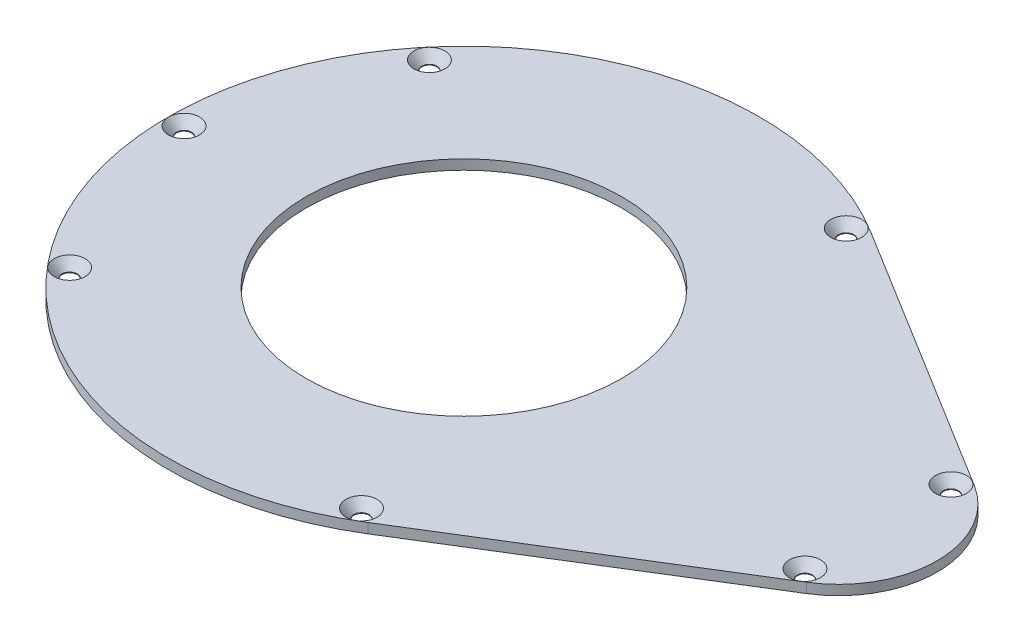
ISO-10303-21;
HEADER;
FILE_DESCRIPTION(('STEP AP214'),'2;1');
FILE_NAME('part.step','',(''),(''),'','','');
FILE_SCHEMA(('AUTOMOTIVE_DESIGN { 1 0 10303 214 1 1 1 1 }'));
ENDSEC;
DATA;
#1=APPLICATION_CONTEXT('core data for automotive mechanical design processes');
#2=APPLICATION_PROTOCOL_DEFINITION('international standard','automotive_design',2000,#1);
#3=PRODUCT_CONTEXT('',#1,'mechanical');
#4=PRODUCT('Part','Part','',(#3));
#5=PRODUCT_RELATED_PRODUCT_CATEGORY('part','',(#4));
#6=PRODUCT_DEFINITION_FORMATION('','',#4);
#7=PRODUCT_DEFINITION_CONTEXT('part definition',#1,'design');
#8=PRODUCT_DEFINITION('design','',#6,#7);
#9=PRODUCT_DEFINITION_SHAPE('','',#8);
#10=(LENGTH_UNIT() NAMED_UNIT(*) SI_UNIT(.MILLI.,.METRE.));
#11=(NAMED_UNIT(*) PLANE_ANGLE_UNIT() SI_UNIT($,.RADIAN.));
#12=(NAMED_UNIT(*) SI_UNIT($,.STERADIAN.) SOLID_ANGLE_UNIT());
#13=UNCERTAINTY_MEASURE_WITH_UNIT(LENGTH_MEASURE(1.E-05),#10,'distance_accuracy_value','');
#14=(GEOMETRIC_REPRESENTATION_CONTEXT(3) GLOBAL_UNCERTAINTY_ASSIGNED_CONTEXT((#13)) GLOBAL_UNIT_ASSIGNED_CONTEXT((#10,
#11,#12)) REPRESENTATION_CONTEXT('',''));
#15=CARTESIAN_POINT('',(0.,0.,0.));
#16=DIRECTION('',(0.,0.,1.));
#17=DIRECTION('',(1.,0.,0.));
#18=AXIS2_PLACEMENT_3D('',#15,#16,#17);
#19=CARTESIAN_POINT('',(60.36818,0.,0.));
#20=DIRECTION('',(0.,-1.,0.));
#21=DIRECTION('',(0.,0.,-1.));
#22=AXIS2_PLACEMENT_3D('',#19,#20,#21);
#23=PLANE('',#22);
#24=CARTESIAN_POINT('',(0.,0.,0.));
#25=DIRECTION('',(0.,1.,0.));
#26=DIRECTION('',(0.,0.,1.));
#27=AXIS2_PLACEMENT_3D('',#24,#25,#26);
#28=CIRCLE('',#27,25.4);
#29=CARTESIAN_POINT('',(0.,0.,25.4));
#30=VERTEX_POINT('',#29);
#31=EDGE_CURVE('E174',#30,#30,#28,.T.);
#32=ORIENTED_EDGE('',*,*,#31,.F.);
#33=EDGE_LOOP('',(#32));
#34=FACE_BOUND('',#33,.T.);
#35=CARTESIAN_POINT('',(22.5424999999999,0.,-39.0447553296215));
#36=DIRECTION('',(0.,1.,0.));
#37=DIRECTION('',(0.,0.,1.));
#38=AXIS2_PLACEMENT_3D('',#35,#36,#37);
#39=CIRCLE('',#38,2.5019);
#40=CARTESIAN_POINT('',(22.5424999999999,0.,-36.5428553296215));
#41=VERTEX_POINT('',#40);
#42=EDGE_CURVE('E170',#41,#41,#39,.T.);
#43=ORIENTED_EDGE('',*,*,#42,.F.);
#44=EDGE_LOOP('',(#43));
#45=FACE_BOUND('',#44,.T.);
#46=CARTESIAN_POINT('',(-34.5371137180191,0.,-28.9800793827177));
#47=DIRECTION('',(0.,1.,0.));
#48=DIRECTION('',(0.,0.,1.));
#49=AXIS2_PLACEMENT_3D('',#46,#47,#48);
#50=CIRCLE('',#49,2.5019);
#51=CARTESIAN_POINT('',(-34.5371137180191,0.,-26.4781793827177));
#52=VERTEX_POINT('',#51);
#53=EDGE_CURVE('E161',#52,#52,#50,.T.);
#54=ORIENTED_EDGE('',*,*,#53,.F.);
#55=EDGE_LOOP('',(#54));
#56=FACE_BOUND('',#55,.T.);
#57=CARTESIAN_POINT('',(-45.085,0.,0.));
#58=DIRECTION('',(0.,1.,0.));
#59=DIRECTION('',(0.,0.,1.));
#60=AXIS2_PLACEMENT_3D('',#57,#58,#59);
#61=CIRCLE('',#60,2.5019);
#62=CARTESIAN_POINT('',(-45.085,0.,2.50190000000001));
#63=VERTEX_POINT('',#62);
#64=EDGE_CURVE('E152',#63,#63,#61,.T.);
#65=ORIENTED_EDGE('',*,*,#64,.F.);
#66=EDGE_LOOP('',(#65));
#67=FACE_BOUND('',#66,.T.);
#68=CARTESIAN_POINT('',(-34.5371137180191,0.,28.9800793827177));
#69=DIRECTION('',(0.,1.,0.));
#70=DIRECTION('',(0.,0.,1.));
#71=AXIS2_PLACEMENT_3D('',#68,#69,#70);
#72=CIRCLE('',#71,2.5019);
#73=CARTESIAN_POINT('',(-34.5371137180191,0.,31.4819793827177));
#74=VERTEX_POINT('',#73);
#75=EDGE_CURVE('E143',#74,#74,#72,.T.);
#76=ORIENTED_EDGE('',*,*,#75,.F.);
#77=EDGE_LOOP('',(#76));
#78=FACE_BOUND('',#77,.T.);
#79=CARTESIAN_POINT('',(22.5424999999999,0.,39.0447553296215));
#80=DIRECTION('',(0.,1.,0.));
#81=DIRECTION('',(0.,0.,1.));
#82=AXIS2_PLACEMENT_3D('',#79,#80,#81);
#83=CIRCLE('',#82,2.5019);
#84=CARTESIAN_POINT('',(22.5424999999999,0.,41.5466553296215));
#85=VERTEX_POINT('',#84);
#86=EDGE_CURVE('E134',#85,#85,#83,.T.);
#87=ORIENTED_EDGE('',*,*,#86,.F.);
#88=EDGE_LOOP('',(#87));
#89=FACE_BOUND('',#88,.T.);
#90=CARTESIAN_POINT('',(66.7027346613234,0.,11.7614918078291));
#91=DIRECTION('',(0.,1.,0.));
#92=DIRECTION('',(0.,0.,1.));
#93=AXIS2_PLACEMENT_3D('',#90,#91,#92);
#94=CIRCLE('',#93,2.5019);
#95=CARTESIAN_POINT('',(66.7027346613234,0.,14.2633918078291));
#96=VERTEX_POINT('',#95);
#97=EDGE_CURVE('E125',#96,#96,#94,.T.);
#98=ORIENTED_EDGE('',*,*,#97,.F.);
#99=EDGE_LOOP('',(#98));
#100=FACE_BOUND('',#99,.T.);
#101=CARTESIAN_POINT('',(66.7027346613234,0.,-11.7614918078291));
#102=DIRECTION('',(0.,1.,0.));
#103=DIRECTION('',(0.,0.,1.));
#104=AXIS2_PLACEMENT_3D('',#101,#102,#103);
#105=CIRCLE('',#104,2.5019);
#106=CARTESIAN_POINT('',(66.7027346613234,0.,-9.25959180782908));
#107=VERTEX_POINT('',#106);
#108=EDGE_CURVE('E116',#107,#107,#105,.T.);
#109=ORIENTED_EDGE('',*,*,#108,.F.);
#110=EDGE_LOOP('',(#109));
#111=FACE_BOUND('',#110,.T.);
#112=CARTESIAN_POINT('',(0.,0.,0.));
#113=DIRECTION('',(0.,-1.,0.));
#114=DIRECTION('',(0.,0.,-1.));
#115=AXIS2_PLACEMENT_3D('',#112,#113,#114);
#116=CIRCLE('',#115,47.625);
#117=CARTESIAN_POINT('',(25.0478604788152,0.,-40.5061144820607));
#118=VERTEX_POINT('',#117);
#119=CARTESIAN_POINT('',(25.0478604788152,0.,40.5061144820607));
#120=VERTEX_POINT('',#119);
#121=EDGE_CURVE('E56',#118,#120,#116,.F.);
#122=ORIENTED_EDGE('',*,*,#121,.T.);
#123=DIRECTION('',(0.850522088862167,0.,-0.525939327639164));
#124=VECTOR('',#123,1.);
#125=CARTESIAN_POINT('',(29.2194054553538,0.,37.9265464862285));
#126=LINE('',#125,#124);
#127=CARTESIAN_POINT('',(68.7174668262717,0.,13.5020381606869));
#128=VERTEX_POINT('',#127);
#129=EDGE_CURVE('E80',#120,#128,#126,.T.);
#130=ORIENTED_EDGE('',*,*,#129,.T.);
#131=CARTESIAN_POINT('',(60.36818,0.,0.));
#132=DIRECTION('',(0.,-1.,0.));
#133=DIRECTION('',(0.,0.,-1.));
#134=AXIS2_PLACEMENT_3D('',#131,#132,#133);
#135=CIRCLE('',#134,15.875);
#136=CARTESIAN_POINT('',(68.7174668262717,0.,-13.5020381606869));
#137=VERTEX_POINT('',#136);
#138=EDGE_CURVE('E82',#128,#137,#135,.F.);
#139=ORIENTED_EDGE('',*,*,#138,.T.);
#140=DIRECTION('',(-0.850522088862165,0.,-0.525939327639168));
#141=VECTOR('',#140,1.);
#142=CARTESIAN_POINT('',(29.2194054553538,0.,-37.9265464862285));
#143=LINE('',#142,#141);
#144=EDGE_CURVE('E93',#137,#118,#143,.T.);
#145=ORIENTED_EDGE('',*,*,#144,.T.);
#146=EDGE_LOOP('',(#122,#130,#139,#145));
#147=FACE_BOUND('',#146,.T.);
#148=ADVANCED_FACE('F39',(#34,#45,#56,#67,#78,#89,#100,#111,#147),#23,.F.);
#149=CARTESIAN_POINT('',(0.,24.13,0.));
#150=DIRECTION('',(0.,-1.,0.));
#151=DIRECTION('',(0.,0.,-1.));
#152=AXIS2_PLACEMENT_3D('',#149,#150,#151);
#153=CYLINDRICAL_SURFACE('',#152,47.625);
#154=DIRECTION('',(0.,1.,0.));
#155=VECTOR('',#154,1.);
#156=CARTESIAN_POINT('',(25.0478604788152,-95.8328857053331,40.5061144820607));
#157=LINE('',#156,#155);
#158=CARTESIAN_POINT('',(25.0478604788152,-1.5875,40.5061144820607));
#159=VERTEX_POINT('',#158);
#160=EDGE_CURVE('E43',#159,#120,#157,.T.);
#161=ORIENTED_EDGE('',*,*,#160,.T.);
#162=ORIENTED_EDGE('',*,*,#121,.F.);
#163=DIRECTION('',(0.,1.,0.));
#164=VECTOR('',#163,1.);
#165=CARTESIAN_POINT('',(25.0478604788152,-95.8328857053331,-40.5061144820607));
#166=LINE('',#165,#164);
#167=CARTESIAN_POINT('',(25.0478604788152,-1.5875,-40.5061144820607));
#168=VERTEX_POINT('',#167);
#169=EDGE_CURVE('E12',#168,#118,#166,.T.);
#170=ORIENTED_EDGE('',*,*,#169,.F.);
#171=CARTESIAN_POINT('',(0.,-1.5875,0.));
#172=DIRECTION('',(0.,-1.,0.));
#173=DIRECTION('',(0.,0.,-1.));
#174=AXIS2_PLACEMENT_3D('',#171,#172,#173);
#175=CIRCLE('',#174,47.625);
#176=EDGE_CURVE('E103',#159,#168,#175,.T.);
#177=ORIENTED_EDGE('',*,*,#176,.F.);
#178=EDGE_LOOP('',(#161,#162,#170,#177));
#179=FACE_BOUND('',#178,.T.);
#180=ADVANCED_FACE('F41',(#179),#153,.T.);
#181=CARTESIAN_POINT('',(25.0478604788152,-95.8328857053331,-40.5061144820607));
#182=DIRECTION('',(0.525939327639164,0.,-0.850522088862167));
#183=DIRECTION('',(-0.850522088862168,0.,-0.525939327639164));
#184=AXIS2_PLACEMENT_3D('',#181,#182,#183);
#185=PLANE('',#184);
#186=ORIENTED_EDGE('',*,*,#144,.F.);
#187=DIRECTION('',(0.,1.,0.));
#188=VECTOR('',#187,1.);
#189=CARTESIAN_POINT('',(68.7174668262717,-95.8328857053331,-13.5020381606869));
#190=LINE('',#189,#188);
#191=CARTESIAN_POINT('',(68.7174668262717,-1.5875,-13.5020381606869));
#192=VERTEX_POINT('',#191);
#193=EDGE_CURVE('E48',#192,#137,#190,.T.);
#194=ORIENTED_EDGE('',*,*,#193,.F.);
#195=DIRECTION('',(0.850522088862167,0.,0.525939327639164));
#196=VECTOR('',#195,1.);
#197=CARTESIAN_POINT('',(25.0478604788151,-1.5875,-40.5061144820607));
#198=LINE('',#197,#196);
#199=EDGE_CURVE('E100',#168,#192,#198,.T.);
#200=ORIENTED_EDGE('',*,*,#199,.F.);
#201=ORIENTED_EDGE('',*,*,#169,.T.);
#202=EDGE_LOOP('',(#186,#194,#200,#201));
#203=FACE_BOUND('',#202,.T.);
#204=ADVANCED_FACE('F227',(#203),#185,.T.);
#205=CARTESIAN_POINT('',(60.36818,-95.8328857053331,0.));
#206=DIRECTION('',(0.,1.,0.));
#207=DIRECTION('',(0.,0.,1.));
#208=AXIS2_PLACEMENT_3D('',#205,#206,#207);
#209=CYLINDRICAL_SURFACE('',#208,15.875);
#210=ORIENTED_EDGE('',*,*,#138,.F.);
#211=DIRECTION('',(0.,1.,0.));
#212=VECTOR('',#211,1.);
#213=CARTESIAN_POINT('',(68.7174668262717,-95.8328857053331,13.5020381606869));
#214=LINE('',#213,#212);
#215=CARTESIAN_POINT('',(68.7174668262717,-1.5875,13.5020381606869));
#216=VERTEX_POINT('',#215);
#217=EDGE_CURVE('E91',#216,#128,#214,.T.);
#218=ORIENTED_EDGE('',*,*,#217,.F.);
#219=CARTESIAN_POINT('',(60.36818,-1.5875,0.));
#220=DIRECTION('',(0.,-1.,0.));
#221=DIRECTION('',(0.,0.,-1.));
#222=AXIS2_PLACEMENT_3D('',#219,#220,#221);
#223=CIRCLE('',#222,15.875);
#224=EDGE_CURVE('E107',#192,#216,#223,.T.);
#225=ORIENTED_EDGE('',*,*,#224,.F.);
#226=ORIENTED_EDGE('',*,*,#193,.T.);
#227=EDGE_LOOP('',(#210,#218,#225,#226));
#228=FACE_BOUND('',#227,.T.);
#229=ADVANCED_FACE('F89',(#228),#209,.T.);
#230=CARTESIAN_POINT('',(25.0478604788152,-95.8328857053331,40.5061144820607));
#231=DIRECTION('',(0.525939327639164,0.,0.850522088862168));
#232=DIRECTION('',(0.850522088862168,0.,-0.525939327639164));
#233=AXIS2_PLACEMENT_3D('',#230,#231,#232);
#234=PLANE('',#233);
#235=ORIENTED_EDGE('',*,*,#129,.F.);
#236=ORIENTED_EDGE('',*,*,#160,.F.);
#237=DIRECTION('',(-0.850522088862167,0.,0.525939327639164));
#238=VECTOR('',#237,1.);
#239=CARTESIAN_POINT('',(68.7174668262717,-1.5875,13.5020381606869));
#240=LINE('',#239,#238);
#241=EDGE_CURVE('E97',#216,#159,#240,.T.);
#242=ORIENTED_EDGE('',*,*,#241,.F.);
#243=ORIENTED_EDGE('',*,*,#217,.T.);
#244=EDGE_LOOP('',(#235,#236,#242,#243));
#245=FACE_BOUND('',#244,.T.);
#246=ADVANCED_FACE('F95',(#245),#234,.T.);
#247=CARTESIAN_POINT('',(60.36818,-1.5875,0.));
#248=DIRECTION('',(0.,-1.,0.));
#249=DIRECTION('',(0.,0.,-1.));
#250=AXIS2_PLACEMENT_3D('',#247,#248,#249);
#251=PLANE('',#250);
#252=CARTESIAN_POINT('',(0.,-1.5875,0.));
#253=DIRECTION('',(0.,1.,0.));
#254=DIRECTION('',(0.,0.,1.));
#255=AXIS2_PLACEMENT_3D('',#252,#253,#254);
#256=CIRCLE('',#255,25.4);
#257=CARTESIAN_POINT('',(0.,-1.5875,25.4));
#258=VERTEX_POINT('',#257);
#259=EDGE_CURVE('E173',#258,#258,#256,.T.);
#260=ORIENTED_EDGE('',*,*,#259,.T.);
#261=EDGE_LOOP('',(#260));
#262=FACE_BOUND('',#261,.T.);
#263=CARTESIAN_POINT('',(22.5424999999999,-1.5875,-39.0447553296215));
#264=DIRECTION('',(0.,1.,0.));
#265=DIRECTION('',(0.,0.,1.));
#266=AXIS2_PLACEMENT_3D('',#263,#264,#265);
#267=CIRCLE('',#266,1.2192);
#268=CARTESIAN_POINT('',(22.5424999999999,-1.5875,-37.8255553296215));
#269=VERTEX_POINT('',#268);
#270=EDGE_CURVE('E164',#269,#269,#267,.T.);
#271=ORIENTED_EDGE('',*,*,#270,.T.);
#272=EDGE_LOOP('',(#271));
#273=FACE_BOUND('',#272,.T.);
#274=CARTESIAN_POINT('',(-34.5371137180191,-1.5875,-28.9800793827177));
#275=DIRECTION('',(0.,1.,0.));
#276=DIRECTION('',(0.,0.,1.));
#277=AXIS2_PLACEMENT_3D('',#274,#275,#276);
#278=CIRCLE('',#277,1.2192);
#279=CARTESIAN_POINT('',(-34.5371137180191,-1.5875,-27.7608793827177));
#280=VERTEX_POINT('',#279);
#281=EDGE_CURVE('E155',#280,#280,#278,.T.);
#282=ORIENTED_EDGE('',*,*,#281,.T.);
#283=EDGE_LOOP('',(#282));
#284=FACE_BOUND('',#283,.T.);
#285=CARTESIAN_POINT('',(-45.085,-1.5875,0.));
#286=DIRECTION('',(0.,1.,0.));
#287=DIRECTION('',(0.,0.,1.));
#288=AXIS2_PLACEMENT_3D('',#285,#286,#287);
#289=CIRCLE('',#288,1.2192);
#290=CARTESIAN_POINT('',(-45.085,-1.5875,1.2192));
#291=VERTEX_POINT('',#290);
#292=EDGE_CURVE('E146',#291,#291,#289,.T.);
#293=ORIENTED_EDGE('',*,*,#292,.T.);
#294=EDGE_LOOP('',(#293));
#295=FACE_BOUND('',#294,.T.);
#296=CARTESIAN_POINT('',(-34.5371137180191,-1.5875,28.9800793827177));
#297=DIRECTION('',(0.,1.,0.));
#298=DIRECTION('',(0.,0.,1.));
#299=AXIS2_PLACEMENT_3D('',#296,#297,#298);
#300=CIRCLE('',#299,1.2192);
#301=CARTESIAN_POINT('',(-34.5371137180191,-1.5875,30.1992793827177));
#302=VERTEX_POINT('',#301);
#303=EDGE_CURVE('E137',#302,#302,#300,.T.);
#304=ORIENTED_EDGE('',*,*,#303,.T.);
#305=EDGE_LOOP('',(#304));
#306=FACE_BOUND('',#305,.T.);
#307=CARTESIAN_POINT('',(22.5424999999999,-1.5875,39.0447553296215));
#308=DIRECTION('',(0.,1.,0.));
#309=DIRECTION('',(0.,0.,1.));
#310=AXIS2_PLACEMENT_3D('',#307,#308,#309);
#311=CIRCLE('',#310,1.2192);
#312=CARTESIAN_POINT('',(22.5424999999999,-1.5875,40.2639553296215));
#313=VERTEX_POINT('',#312);
#314=EDGE_CURVE('E128',#313,#313,#311,.T.);
#315=ORIENTED_EDGE('',*,*,#314,.T.);
#316=EDGE_LOOP('',(#315));
#317=FACE_BOUND('',#316,.T.);
#318=CARTESIAN_POINT('',(66.7027346613234,-1.5875,11.7614918078291));
#319=DIRECTION('',(0.,1.,0.));
#320=DIRECTION('',(0.,0.,1.));
#321=AXIS2_PLACEMENT_3D('',#318,#319,#320);
#322=CIRCLE('',#321,1.2192);
#323=CARTESIAN_POINT('',(66.7027346613234,-1.5875,12.9806918078291));
#324=VERTEX_POINT('',#323);
#325=EDGE_CURVE('E119',#324,#324,#322,.T.);
#326=ORIENTED_EDGE('',*,*,#325,.T.);
#327=EDGE_LOOP('',(#326));
#328=FACE_BOUND('',#327,.T.);
#329=CARTESIAN_POINT('',(66.7027346613234,-1.5875,-11.7614918078291));
#330=DIRECTION('',(0.,1.,0.));
#331=DIRECTION('',(0.,0.,1.));
#332=AXIS2_PLACEMENT_3D('',#329,#330,#331);
#333=CIRCLE('',#332,1.2192);
#334=CARTESIAN_POINT('',(66.7027346613234,-1.5875,-10.5422918078291));
#335=VERTEX_POINT('',#334);
#336=EDGE_CURVE('E86',#335,#335,#333,.T.);
#337=ORIENTED_EDGE('',*,*,#336,.T.);
#338=EDGE_LOOP('',(#337));
#339=FACE_BOUND('',#338,.T.);
#340=ORIENTED_EDGE('',*,*,#224,.T.);
#341=ORIENTED_EDGE('',*,*,#241,.T.);
#342=ORIENTED_EDGE('',*,*,#176,.T.);
#343=ORIENTED_EDGE('',*,*,#199,.T.);
#344=EDGE_LOOP('',(#340,#341,#342,#343));
#345=FACE_BOUND('',#344,.T.);
#346=ADVANCED_FACE('F180',(#262,#273,#284,#295,#306,#317,#328,#339,#345),#251,.T.);
#347=CARTESIAN_POINT('',(66.7027346613234,0.,-11.7614918078291));
#348=DIRECTION('',(0.,1.,0.));
#349=DIRECTION('',(0.,0.,1.));
#350=AXIS2_PLACEMENT_3D('',#347,#348,#349);
#351=CYLINDRICAL_SURFACE('',#350,1.2192);
#352=ORIENTED_EDGE('',*,*,#336,.F.);
#353=EDGE_LOOP('',(#352));
#354=FACE_BOUND('',#353,.T.);
#355=CARTESIAN_POINT('',(66.7027346613234,-1.4755775559424,-11.7614918078291));
#356=DIRECTION('',(0.,1.,0.));
#357=DIRECTION('',(0.,0.,1.));
#358=AXIS2_PLACEMENT_3D('',#355,#356,#357);
#359=CIRCLE('',#358,1.21919999999999);
#360=CARTESIAN_POINT('',(66.7027346613234,-1.4755775559424,-10.5422918078291));
#361=VERTEX_POINT('',#360);
#362=EDGE_CURVE('E113',#361,#361,#359,.T.);
#363=ORIENTED_EDGE('',*,*,#362,.T.);
#364=EDGE_LOOP('',(#363));
#365=FACE_BOUND('',#364,.T.);
#366=ADVANCED_FACE('F210',(#354,#365),#351,.F.);
#367=CARTESIAN_POINT('',(66.7027346613234,0.,-11.7614918078291));
#368=DIRECTION('',(0.,1.,0.));
#369=DIRECTION('',(0.,0.,1.));
#370=AXIS2_PLACEMENT_3D('',#367,#368,#369);
#371=CONICAL_SURFACE('',#370,2.5019,0.715584993317677);
#372=ORIENTED_EDGE('',*,*,#362,.F.);
#373=EDGE_LOOP('',(#372));
#374=FACE_BOUND('',#373,.T.);
#375=ORIENTED_EDGE('',*,*,#108,.T.);
#376=EDGE_LOOP('',(#375));
#377=FACE_BOUND('',#376,.T.);
#378=ADVANCED_FACE('F207',(#374,#377),#371,.F.);
#379=CARTESIAN_POINT('',(66.7027346613234,0.,11.7614918078291));
#380=DIRECTION('',(0.,1.,0.));
#381=DIRECTION('',(0.,0.,1.));
#382=AXIS2_PLACEMENT_3D('',#379,#380,#381);
#383=CYLINDRICAL_SURFACE('',#382,1.2192);
#384=ORIENTED_EDGE('',*,*,#325,.F.);
#385=EDGE_LOOP('',(#384));
#386=FACE_BOUND('',#385,.T.);
#387=CARTESIAN_POINT('',(66.7027346613234,-1.4755775559424,11.7614918078291));
#388=DIRECTION('',(0.,1.,0.));
#389=DIRECTION('',(0.,0.,1.));
#390=AXIS2_PLACEMENT_3D('',#387,#388,#389);
#391=CIRCLE('',#390,1.21919999999999);
#392=CARTESIAN_POINT('',(66.7027346613234,-1.4755775559424,12.9806918078291));
#393=VERTEX_POINT('',#392);
#394=EDGE_CURVE('E122',#393,#393,#391,.T.);
#395=ORIENTED_EDGE('',*,*,#394,.T.);
#396=EDGE_LOOP('',(#395));
#397=FACE_BOUND('',#396,.T.);
#398=ADVANCED_FACE('F209',(#386,#397),#383,.F.);
#399=CARTESIAN_POINT('',(66.7027346613234,0.,11.7614918078291));
#400=DIRECTION('',(0.,1.,0.));
#401=DIRECTION('',(0.,0.,1.));
#402=AXIS2_PLACEMENT_3D('',#399,#400,#401);
#403=CONICAL_SURFACE('',#402,2.5019,0.715584993317677);
#404=ORIENTED_EDGE('',*,*,#394,.F.);
#405=EDGE_LOOP('',(#404));
#406=FACE_BOUND('',#405,.T.);
#407=ORIENTED_EDGE('',*,*,#97,.T.);
#408=EDGE_LOOP('',(#407));
#409=FACE_BOUND('',#408,.T.);
#410=ADVANCED_FACE('F217',(#406,#409),#403,.F.);
#411=CARTESIAN_POINT('',(22.5424999999999,0.,39.0447553296215));
#412=DIRECTION('',(0.,1.,0.));
#413=DIRECTION('',(0.,0.,1.));
#414=AXIS2_PLACEMENT_3D('',#411,#412,#413);
#415=CYLINDRICAL_SURFACE('',#414,1.21919999999999);
#416=ORIENTED_EDGE('',*,*,#314,.F.);
#417=EDGE_LOOP('',(#416));
#418=FACE_BOUND('',#417,.T.);
#419=CARTESIAN_POINT('',(22.5424999999999,-1.4755775559424,39.0447553296215));
#420=DIRECTION('',(0.,1.,0.));
#421=DIRECTION('',(0.,0.,1.));
#422=AXIS2_PLACEMENT_3D('',#419,#420,#421);
#423=CIRCLE('',#422,1.21919999999999);
#424=CARTESIAN_POINT('',(22.5424999999999,-1.4755775559424,40.2639553296215));
#425=VERTEX_POINT('',#424);
#426=EDGE_CURVE('E131',#425,#425,#423,.T.);
#427=ORIENTED_EDGE('',*,*,#426,.T.);
#428=EDGE_LOOP('',(#427));
#429=FACE_BOUND('',#428,.T.);
#430=ADVANCED_FACE('F266',(#418,#429),#415,.F.);
#431=CARTESIAN_POINT('',(22.5424999999999,0.,39.0447553296215));
#432=DIRECTION('',(0.,1.,0.));
#433=DIRECTION('',(0.,0.,1.));
#434=AXIS2_PLACEMENT_3D('',#431,#432,#433);
#435=CONICAL_SURFACE('',#434,2.5019,0.715584993317677);
#436=ORIENTED_EDGE('',*,*,#426,.F.);
#437=EDGE_LOOP('',(#436));
#438=FACE_BOUND('',#437,.T.);
#439=ORIENTED_EDGE('',*,*,#86,.T.);
#440=EDGE_LOOP('',(#439));
#441=FACE_BOUND('',#440,.T.);
#442=ADVANCED_FACE('F275',(#438,#441),#435,.F.);
#443=CARTESIAN_POINT('',(-34.5371137180191,0.,28.9800793827177));
#444=DIRECTION('',(0.,1.,0.));
#445=DIRECTION('',(0.,0.,1.));
#446=AXIS2_PLACEMENT_3D('',#443,#444,#445);
#447=CYLINDRICAL_SURFACE('',#446,1.21919999999999);
#448=ORIENTED_EDGE('',*,*,#303,.F.);
#449=EDGE_LOOP('',(#448));
#450=FACE_BOUND('',#449,.T.);
#451=CARTESIAN_POINT('',(-34.5371137180191,-1.4755775559424,28.9800793827177));
#452=DIRECTION('',(0.,1.,0.));
#453=DIRECTION('',(0.,0.,1.));
#454=AXIS2_PLACEMENT_3D('',#451,#452,#453);
#455=CIRCLE('',#454,1.21919999999999);
#456=CARTESIAN_POINT('',(-34.5371137180191,-1.4755775559424,30.1992793827177));
#457=VERTEX_POINT('',#456);
#458=EDGE_CURVE('E140',#457,#457,#455,.T.);
#459=ORIENTED_EDGE('',*,*,#458,.T.);
#460=EDGE_LOOP('',(#459));
#461=FACE_BOUND('',#460,.T.);
#462=ADVANCED_FACE('F285',(#450,#461),#447,.F.);
#463=CARTESIAN_POINT('',(-34.5371137180191,0.,28.9800793827177));
#464=DIRECTION('',(0.,1.,0.));
#465=DIRECTION('',(0.,0.,1.));
#466=AXIS2_PLACEMENT_3D('',#463,#464,#465);
#467=CONICAL_SURFACE('',#466,2.5019,0.715584993317677);
#468=ORIENTED_EDGE('',*,*,#458,.F.);
#469=EDGE_LOOP('',(#468));
#470=FACE_BOUND('',#469,.T.);
#471=ORIENTED_EDGE('',*,*,#75,.T.);
#472=EDGE_LOOP('',(#471));
#473=FACE_BOUND('',#472,.T.);
#474=ADVANCED_FACE('F295',(#470,#473),#467,.F.);
#475=CARTESIAN_POINT('',(-45.085,0.,0.));
#476=DIRECTION('',(0.,1.,0.));
#477=DIRECTION('',(0.,0.,1.));
#478=AXIS2_PLACEMENT_3D('',#475,#476,#477);
#479=CYLINDRICAL_SURFACE('',#478,1.21919999999999);
#480=ORIENTED_EDGE('',*,*,#292,.F.);
#481=EDGE_LOOP('',(#480));
#482=FACE_BOUND('',#481,.T.);
#483=CARTESIAN_POINT('',(-45.085,-1.4755775559424,0.));
#484=DIRECTION('',(0.,1.,0.));
#485=DIRECTION('',(0.,0.,1.));
#486=AXIS2_PLACEMENT_3D('',#483,#484,#485);
#487=CIRCLE('',#486,1.21919999999999);
#488=CARTESIAN_POINT('',(-45.085,-1.4755775559424,1.2192));
#489=VERTEX_POINT('',#488);
#490=EDGE_CURVE('E149',#489,#489,#487,.T.);
#491=ORIENTED_EDGE('',*,*,#490,.T.);
#492=EDGE_LOOP('',(#491));
#493=FACE_BOUND('',#492,.T.);
#494=ADVANCED_FACE('F305',(#482,#493),#479,.F.);
#495=CARTESIAN_POINT('',(-45.085,0.,0.));
#496=DIRECTION('',(0.,1.,0.));
#497=DIRECTION('',(0.,0.,1.));
#498=AXIS2_PLACEMENT_3D('',#495,#496,#497);
#499=CONICAL_SURFACE('',#498,2.5019,0.715584993317677);
#500=ORIENTED_EDGE('',*,*,#490,.F.);
#501=EDGE_LOOP('',(#500));
#502=FACE_BOUND('',#501,.T.);
#503=ORIENTED_EDGE('',*,*,#64,.T.);
#504=EDGE_LOOP('',(#503));
#505=FACE_BOUND('',#504,.T.);
#506=ADVANCED_FACE('F315',(#502,#505),#499,.F.);
#507=CARTESIAN_POINT('',(-34.5371137180191,0.,-28.9800793827177));
#508=DIRECTION('',(0.,1.,0.));
#509=DIRECTION('',(0.,0.,1.));
#510=AXIS2_PLACEMENT_3D('',#507,#508,#509);
#511=CYLINDRICAL_SURFACE('',#510,1.21919999999999);
#512=ORIENTED_EDGE('',*,*,#281,.F.);
#513=EDGE_LOOP('',(#512));
#514=FACE_BOUND('',#513,.T.);
#515=CARTESIAN_POINT('',(-34.5371137180191,-1.4755775559424,-28.9800793827177));
#516=DIRECTION('',(0.,1.,0.));
#517=DIRECTION('',(0.,0.,1.));
#518=AXIS2_PLACEMENT_3D('',#515,#516,#517);
#519=CIRCLE('',#518,1.21919999999999);
#520=CARTESIAN_POINT('',(-34.5371137180191,-1.4755775559424,-27.7608793827177));
#521=VERTEX_POINT('',#520);
#522=EDGE_CURVE('E158',#521,#521,#519,.T.);
#523=ORIENTED_EDGE('',*,*,#522,.T.);
#524=EDGE_LOOP('',(#523));
#525=FACE_BOUND('',#524,.T.);
#526=ADVANCED_FACE('F325',(#514,#525),#511,.F.);
#527=CARTESIAN_POINT('',(-34.5371137180191,0.,-28.9800793827177));
#528=DIRECTION('',(0.,1.,0.));
#529=DIRECTION('',(0.,0.,1.));
#530=AXIS2_PLACEMENT_3D('',#527,#528,#529);
#531=CONICAL_SURFACE('',#530,2.5019,0.715584993317677);
#532=ORIENTED_EDGE('',*,*,#522,.F.);
#533=EDGE_LOOP('',(#532));
#534=FACE_BOUND('',#533,.T.);
#535=ORIENTED_EDGE('',*,*,#53,.T.);
#536=EDGE_LOOP('',(#535));
#537=FACE_BOUND('',#536,.T.);
#538=ADVANCED_FACE('F335',(#534,#537),#531,.F.);
#539=CARTESIAN_POINT('',(22.5424999999999,0.,-39.0447553296215));
#540=DIRECTION('',(0.,1.,0.));
#541=DIRECTION('',(0.,0.,1.));
#542=AXIS2_PLACEMENT_3D('',#539,#540,#541);
#543=CYLINDRICAL_SURFACE('',#542,1.21919999999999);
#544=ORIENTED_EDGE('',*,*,#270,.F.);
#545=EDGE_LOOP('',(#544));
#546=FACE_BOUND('',#545,.T.);
#547=CARTESIAN_POINT('',(22.5424999999999,-1.4755775559424,-39.0447553296215));
#548=DIRECTION('',(0.,1.,0.));
#549=DIRECTION('',(0.,0.,1.));
#550=AXIS2_PLACEMENT_3D('',#547,#548,#549);
#551=CIRCLE('',#550,1.21919999999999);
#552=CARTESIAN_POINT('',(22.5424999999999,-1.4755775559424,-37.8255553296215));
#553=VERTEX_POINT('',#552);
#554=EDGE_CURVE('E167',#553,#553,#551,.T.);
#555=ORIENTED_EDGE('',*,*,#554,.T.);
#556=EDGE_LOOP('',(#555));
#557=FACE_BOUND('',#556,.T.);
#558=ADVANCED_FACE('F345',(#546,#557),#543,.F.);
#559=CARTESIAN_POINT('',(22.5424999999999,0.,-39.0447553296215));
#560=DIRECTION('',(0.,1.,0.));
#561=DIRECTION('',(0.,0.,1.));
#562=AXIS2_PLACEMENT_3D('',#559,#560,#561);
#563=CONICAL_SURFACE('',#562,2.5019,0.715584993317677);
#564=ORIENTED_EDGE('',*,*,#554,.F.);
#565=EDGE_LOOP('',(#564));
#566=FACE_BOUND('',#565,.T.);
#567=ORIENTED_EDGE('',*,*,#42,.T.);
#568=EDGE_LOOP('',(#567));
#569=FACE_BOUND('',#568,.T.);
#570=ADVANCED_FACE('F186',(#566,#569),#563,.F.);
#571=CARTESIAN_POINT('',(0.,-1.5875,0.));
#572=DIRECTION('',(0.,1.,0.));
#573=DIRECTION('',(0.,0.,1.));
#574=AXIS2_PLACEMENT_3D('',#571,#572,#573);
#575=CYLINDRICAL_SURFACE('',#574,25.4);
#576=ORIENTED_EDGE('',*,*,#259,.F.);
#577=EDGE_LOOP('',(#576));
#578=FACE_BOUND('',#577,.T.);
#579=ORIENTED_EDGE('',*,*,#31,.T.);
#580=EDGE_LOOP('',(#579));
#581=FACE_BOUND('',#580,.T.);
#582=ADVANCED_FACE('F183',(#578,#581),#575,.F.);
#583=CLOSED_SHELL('',(#148,#180,#204,#229,#246,#346,#366,#378,#398,#410,#430,#442,#462,#474,
#494,#506,#526,#538,#558,#570,#582));
#584=MANIFOLD_SOLID_BREP('B2',#583);
#585=ADVANCED_BREP_SHAPE_REPRESENTATION('',(#18,#584),#14);
#586=SHAPE_DEFINITION_REPRESENTATION(#9,#585);
ENDSEC;
END-ISO-10303-21;
